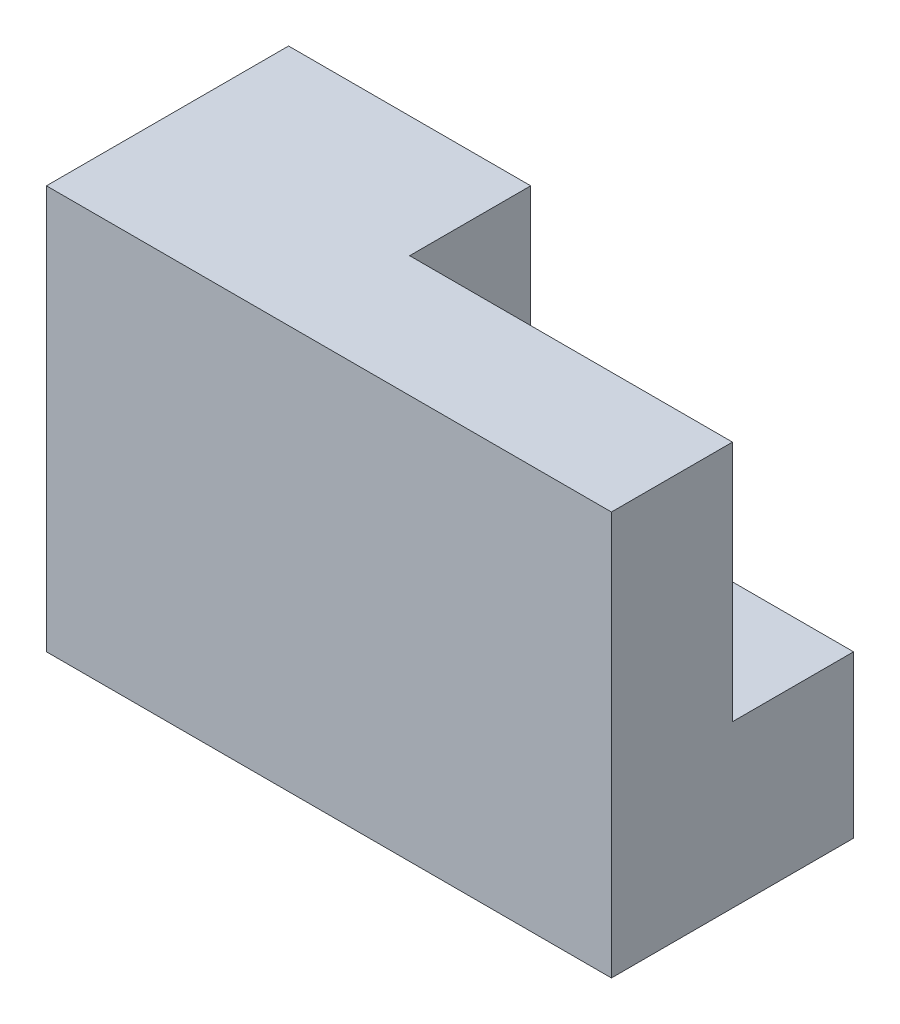
ISO-10303-21;
HEADER;
FILE_DESCRIPTION(('STEP AP214'),'2;1');
FILE_NAME('part.step','',(''),(''),'','','');
FILE_SCHEMA(('AUTOMOTIVE_DESIGN { 1 0 10303 214 1 1 1 1 }'));
ENDSEC;
DATA;
#1=APPLICATION_CONTEXT('core data for automotive mechanical design processes');
#2=APPLICATION_PROTOCOL_DEFINITION('international standard','automotive_design',2000,#1);
#3=PRODUCT_CONTEXT('',#1,'mechanical');
#4=PRODUCT('Part','Part','',(#3));
#5=PRODUCT_RELATED_PRODUCT_CATEGORY('part','',(#4));
#6=PRODUCT_DEFINITION_FORMATION('','',#4);
#7=PRODUCT_DEFINITION_CONTEXT('part definition',#1,'design');
#8=PRODUCT_DEFINITION('design','',#6,#7);
#9=PRODUCT_DEFINITION_SHAPE('','',#8);
#10=(LENGTH_UNIT() NAMED_UNIT(*) SI_UNIT(.MILLI.,.METRE.));
#11=(NAMED_UNIT(*) PLANE_ANGLE_UNIT() SI_UNIT($,.RADIAN.));
#12=(NAMED_UNIT(*) SI_UNIT($,.STERADIAN.) SOLID_ANGLE_UNIT());
#13=UNCERTAINTY_MEASURE_WITH_UNIT(LENGTH_MEASURE(1.E-05),#10,'distance_accuracy_value','');
#14=(GEOMETRIC_REPRESENTATION_CONTEXT(3) GLOBAL_UNCERTAINTY_ASSIGNED_CONTEXT((#13)) GLOBAL_UNIT_ASSIGNED_CONTEXT((#10,
#11,#12)) REPRESENTATION_CONTEXT('',''));
#15=CARTESIAN_POINT('',(0.,0.,0.));
#16=DIRECTION('',(0.,0.,1.));
#17=DIRECTION('',(1.,0.,0.));
#18=AXIS2_PLACEMENT_3D('',#15,#16,#17);
#19=CARTESIAN_POINT('',(0.,20.,-0.0001));
#20=DIRECTION('',(0.,1.,0.));
#21=DIRECTION('',(0.,0.,1.));
#22=AXIS2_PLACEMENT_3D('',#19,#20,#21);
#23=PLANE('',#22);
#24=DIRECTION('',(0.,0.,-1.));
#25=VECTOR('',#24,1.);
#26=CARTESIAN_POINT('',(30.,20.,30.));
#27=LINE('',#26,#25);
#28=CARTESIAN_POINT('',(30.,20.,14.99995));
#29=VERTEX_POINT('',#28);
#30=CARTESIAN_POINT('',(30.,20.,-0.0001));
#31=VERTEX_POINT('',#30);
#32=EDGE_CURVE('E127',#29,#31,#27,.T.);
#33=ORIENTED_EDGE('',*,*,#32,.F.);
#34=DIRECTION('',(-1.,0.,0.));
#35=VECTOR('',#34,1.);
#36=CARTESIAN_POINT('',(30.,20.,14.99995));
#37=LINE('',#36,#35);
#38=CARTESIAN_POINT('',(70.,20.,14.99995));
#39=VERTEX_POINT('',#38);
#40=EDGE_CURVE('E120',#39,#29,#37,.T.);
#41=ORIENTED_EDGE('',*,*,#40,.F.);
#42=DIRECTION('',(0.,0.,1.));
#43=VECTOR('',#42,1.);
#44=CARTESIAN_POINT('',(70.,20.,-0.0001));
#45=LINE('',#44,#43);
#46=CARTESIAN_POINT('',(70.,20.,-0.0001));
#47=VERTEX_POINT('',#46);
#48=EDGE_CURVE('E11',#47,#39,#45,.T.);
#49=ORIENTED_EDGE('',*,*,#48,.F.);
#50=DIRECTION('',(-1.,0.,0.));
#51=VECTOR('',#50,1.);
#52=CARTESIAN_POINT('',(0.,20.,-0.0001));
#53=LINE('',#52,#51);
#54=EDGE_CURVE('E146',#47,#31,#53,.T.);
#55=ORIENTED_EDGE('',*,*,#54,.T.);
#56=EDGE_LOOP('',(#33,#41,#49,#55));
#57=FACE_BOUND('',#56,.T.);
#58=ADVANCED_FACE('F33',(#57),#23,.T.);
#59=CARTESIAN_POINT('',(30.,50.,30.));
#60=DIRECTION('',(-1.,0.,0.));
#61=DIRECTION('',(0.,0.,1.));
#62=AXIS2_PLACEMENT_3D('',#59,#60,#61);
#63=PLANE('',#62);
#64=DIRECTION('',(0.,-1.,0.));
#65=VECTOR('',#64,1.);
#66=CARTESIAN_POINT('',(30.,50.,14.99995));
#67=LINE('',#66,#65);
#68=CARTESIAN_POINT('',(30.,50.,14.99995));
#69=VERTEX_POINT('',#68);
#70=EDGE_CURVE('E50',#69,#29,#67,.T.);
#71=ORIENTED_EDGE('',*,*,#70,.T.);
#72=ORIENTED_EDGE('',*,*,#32,.T.);
#73=DIRECTION('',(0.,-1.,0.));
#74=VECTOR('',#73,1.);
#75=CARTESIAN_POINT('',(30.,50.,-0.0001));
#76=LINE('',#75,#74);
#77=CARTESIAN_POINT('',(30.,50.,-0.0001));
#78=VERTEX_POINT('',#77);
#79=EDGE_CURVE('E132',#78,#31,#76,.T.);
#80=ORIENTED_EDGE('',*,*,#79,.F.);
#81=DIRECTION('',(0.,0.,-1.));
#82=VECTOR('',#81,1.);
#83=CARTESIAN_POINT('',(30.,50.,30.));
#84=LINE('',#83,#82);
#85=EDGE_CURVE('E115',#69,#78,#84,.T.);
#86=ORIENTED_EDGE('',*,*,#85,.F.);
#87=EDGE_LOOP('',(#71,#72,#80,#86));
#88=FACE_BOUND('',#87,.T.);
#89=ADVANCED_FACE('F161',(#88),#63,.F.);
#90=CARTESIAN_POINT('',(0.,0.,-0.0001));
#91=DIRECTION('',(-1.,0.,0.));
#92=DIRECTION('',(0.,0.,1.));
#93=AXIS2_PLACEMENT_3D('',#90,#91,#92);
#94=PLANE('',#93);
#95=DIRECTION('',(0.,0.,1.));
#96=VECTOR('',#95,1.);
#97=CARTESIAN_POINT('',(0.,0.,-0.0001));
#98=LINE('',#97,#96);
#99=CARTESIAN_POINT('',(0.,0.,-0.0001));
#100=VERTEX_POINT('',#99);
#101=CARTESIAN_POINT('',(0.,0.,30.));
#102=VERTEX_POINT('',#101);
#103=EDGE_CURVE('E37',#100,#102,#98,.T.);
#104=ORIENTED_EDGE('',*,*,#103,.T.);
#105=DIRECTION('',(0.,-1.,0.));
#106=VECTOR('',#105,1.);
#107=CARTESIAN_POINT('',(0.,0.,30.));
#108=LINE('',#107,#106);
#109=CARTESIAN_POINT('',(0.,50.,30.));
#110=VERTEX_POINT('',#109);
#111=EDGE_CURVE('E136',#110,#102,#108,.T.);
#112=ORIENTED_EDGE('',*,*,#111,.F.);
#113=DIRECTION('',(0.,0.,1.));
#114=VECTOR('',#113,1.);
#115=CARTESIAN_POINT('',(0.,50.,30.));
#116=LINE('',#115,#114);
#117=CARTESIAN_POINT('',(0.,50.,-0.0001));
#118=VERTEX_POINT('',#117);
#119=EDGE_CURVE('E114',#118,#110,#116,.T.);
#120=ORIENTED_EDGE('',*,*,#119,.F.);
#121=DIRECTION('',(0.,-1.,0.));
#122=VECTOR('',#121,1.);
#123=CARTESIAN_POINT('',(0.,0.,-0.0001));
#124=LINE('',#123,#122);
#125=EDGE_CURVE('E106',#118,#100,#124,.T.);
#126=ORIENTED_EDGE('',*,*,#125,.T.);
#127=EDGE_LOOP('',(#104,#112,#120,#126));
#128=FACE_BOUND('',#127,.T.);
#129=ADVANCED_FACE('F35',(#128),#94,.T.);
#130=CARTESIAN_POINT('',(70.,0.,-0.0001));
#131=DIRECTION('',(1.,0.,0.));
#132=DIRECTION('',(0.,0.,-1.));
#133=AXIS2_PLACEMENT_3D('',#130,#131,#132);
#134=PLANE('',#133);
#135=ORIENTED_EDGE('',*,*,#48,.T.);
#136=DIRECTION('',(0.,-1.,0.));
#137=VECTOR('',#136,1.);
#138=CARTESIAN_POINT('',(70.,50.,14.99995));
#139=LINE('',#138,#137);
#140=CARTESIAN_POINT('',(70.,50.,14.99995));
#141=VERTEX_POINT('',#140);
#142=EDGE_CURVE('E118',#141,#39,#139,.T.);
#143=ORIENTED_EDGE('',*,*,#142,.F.);
#144=DIRECTION('',(0.,0.,-1.));
#145=VECTOR('',#144,1.);
#146=CARTESIAN_POINT('',(70.,50.,30.));
#147=LINE('',#146,#145);
#148=CARTESIAN_POINT('',(70.,50.,30.));
#149=VERTEX_POINT('',#148);
#150=EDGE_CURVE('E110',#149,#141,#147,.T.);
#151=ORIENTED_EDGE('',*,*,#150,.F.);
#152=DIRECTION('',(0.,1.,0.));
#153=VECTOR('',#152,1.);
#154=CARTESIAN_POINT('',(70.,0.,30.));
#155=LINE('',#154,#153);
#156=CARTESIAN_POINT('',(70.,0.,30.));
#157=VERTEX_POINT('',#156);
#158=EDGE_CURVE('E96',#157,#149,#155,.T.);
#159=ORIENTED_EDGE('',*,*,#158,.F.);
#160=DIRECTION('',(0.,0.,1.));
#161=VECTOR('',#160,1.);
#162=CARTESIAN_POINT('',(70.,0.,-0.0001));
#163=LINE('',#162,#161);
#164=CARTESIAN_POINT('',(70.,0.,-0.0001));
#165=VERTEX_POINT('',#164);
#166=EDGE_CURVE('E42',#165,#157,#163,.T.);
#167=ORIENTED_EDGE('',*,*,#166,.F.);
#168=DIRECTION('',(0.,1.,0.));
#169=VECTOR('',#168,1.);
#170=CARTESIAN_POINT('',(70.,0.,-0.0001));
#171=LINE('',#170,#169);
#172=EDGE_CURVE('E144',#165,#47,#171,.T.);
#173=ORIENTED_EDGE('',*,*,#172,.T.);
#174=EDGE_LOOP('',(#135,#143,#151,#159,#167,#173));
#175=FACE_BOUND('',#174,.T.);
#176=ADVANCED_FACE('F117',(#175),#134,.T.);
#177=CARTESIAN_POINT('',(0.,0.,-0.0001));
#178=DIRECTION('',(0.,-1.,0.));
#179=DIRECTION('',(0.,0.,-1.));
#180=AXIS2_PLACEMENT_3D('',#177,#178,#179);
#181=PLANE('',#180);
#182=ORIENTED_EDGE('',*,*,#166,.T.);
#183=DIRECTION('',(1.,0.,0.));
#184=VECTOR('',#183,1.);
#185=CARTESIAN_POINT('',(0.,0.,30.));
#186=LINE('',#185,#184);
#187=EDGE_CURVE('E103',#102,#157,#186,.T.);
#188=ORIENTED_EDGE('',*,*,#187,.F.);
#189=ORIENTED_EDGE('',*,*,#103,.F.);
#190=DIRECTION('',(1.,0.,0.));
#191=VECTOR('',#190,1.);
#192=CARTESIAN_POINT('',(0.,0.,-0.0001));
#193=LINE('',#192,#191);
#194=EDGE_CURVE('E141',#100,#165,#193,.T.);
#195=ORIENTED_EDGE('',*,*,#194,.T.);
#196=EDGE_LOOP('',(#182,#188,#189,#195));
#197=FACE_BOUND('',#196,.T.);
#198=ADVANCED_FACE('F150',(#197),#181,.T.);
#199=CARTESIAN_POINT('',(0.,0.,-0.0001));
#200=DIRECTION('',(0.,0.,-1.));
#201=DIRECTION('',(-1.,0.,0.));
#202=AXIS2_PLACEMENT_3D('',#199,#200,#201);
#203=PLANE('',#202);
#204=ORIENTED_EDGE('',*,*,#125,.F.);
#205=DIRECTION('',(-1.,0.,0.));
#206=VECTOR('',#205,1.);
#207=CARTESIAN_POINT('',(0.,50.,-0.0001));
#208=LINE('',#207,#206);
#209=EDGE_CURVE('E130',#78,#118,#208,.T.);
#210=ORIENTED_EDGE('',*,*,#209,.F.);
#211=ORIENTED_EDGE('',*,*,#79,.T.);
#212=ORIENTED_EDGE('',*,*,#54,.F.);
#213=ORIENTED_EDGE('',*,*,#172,.F.);
#214=ORIENTED_EDGE('',*,*,#194,.F.);
#215=EDGE_LOOP('',(#204,#210,#211,#212,#213,#214));
#216=FACE_BOUND('',#215,.T.);
#217=ADVANCED_FACE('F152',(#216),#203,.T.);
#218=CARTESIAN_POINT('',(0.,0.,30.));
#219=DIRECTION('',(0.,0.,-1.));
#220=DIRECTION('',(-1.,0.,0.));
#221=AXIS2_PLACEMENT_3D('',#218,#219,#220);
#222=PLANE('',#221);
#223=ORIENTED_EDGE('',*,*,#111,.T.);
#224=ORIENTED_EDGE('',*,*,#187,.T.);
#225=ORIENTED_EDGE('',*,*,#158,.T.);
#226=DIRECTION('',(1.,0.,0.));
#227=VECTOR('',#226,1.);
#228=CARTESIAN_POINT('',(0.,50.,30.));
#229=LINE('',#228,#227);
#230=EDGE_CURVE('E100',#110,#149,#229,.T.);
#231=ORIENTED_EDGE('',*,*,#230,.F.);
#232=EDGE_LOOP('',(#223,#224,#225,#231));
#233=FACE_BOUND('',#232,.T.);
#234=ADVANCED_FACE('F99',(#233),#222,.F.);
#235=CARTESIAN_POINT('',(0.,50.,0.));
#236=DIRECTION('',(0.,-1.,0.));
#237=DIRECTION('',(0.,0.,-1.));
#238=AXIS2_PLACEMENT_3D('',#235,#236,#237);
#239=PLANE('',#238);
#240=ORIENTED_EDGE('',*,*,#119,.T.);
#241=ORIENTED_EDGE('',*,*,#230,.T.);
#242=ORIENTED_EDGE('',*,*,#150,.T.);
#243=DIRECTION('',(-1.,0.,0.));
#244=VECTOR('',#243,1.);
#245=CARTESIAN_POINT('',(30.,50.,14.99995));
#246=LINE('',#245,#244);
#247=EDGE_CURVE('E119',#141,#69,#246,.T.);
#248=ORIENTED_EDGE('',*,*,#247,.T.);
#249=ORIENTED_EDGE('',*,*,#85,.T.);
#250=ORIENTED_EDGE('',*,*,#209,.T.);
#251=EDGE_LOOP('',(#240,#241,#242,#248,#249,#250));
#252=FACE_BOUND('',#251,.T.);
#253=ADVANCED_FACE('F109',(#252),#239,.F.);
#254=CARTESIAN_POINT('',(30.,50.,14.99995));
#255=DIRECTION('',(0.,0.,1.));
#256=DIRECTION('',(1.,0.,0.));
#257=AXIS2_PLACEMENT_3D('',#254,#255,#256);
#258=PLANE('',#257);
#259=ORIENTED_EDGE('',*,*,#40,.T.);
#260=ORIENTED_EDGE('',*,*,#70,.F.);
#261=ORIENTED_EDGE('',*,*,#247,.F.);
#262=ORIENTED_EDGE('',*,*,#142,.T.);
#263=EDGE_LOOP('',(#259,#260,#261,#262));
#264=FACE_BOUND('',#263,.T.);
#265=ADVANCED_FACE('F174',(#264),#258,.F.);
#266=CLOSED_SHELL('',(#58,#89,#129,#176,#198,#217,#234,#253,#265));
#267=MANIFOLD_SOLID_BREP('B2',#266);
#268=ADVANCED_BREP_SHAPE_REPRESENTATION('',(#18,#267),#14);
#269=SHAPE_DEFINITION_REPRESENTATION(#9,#268);
ENDSEC;
END-ISO-10303-21;
